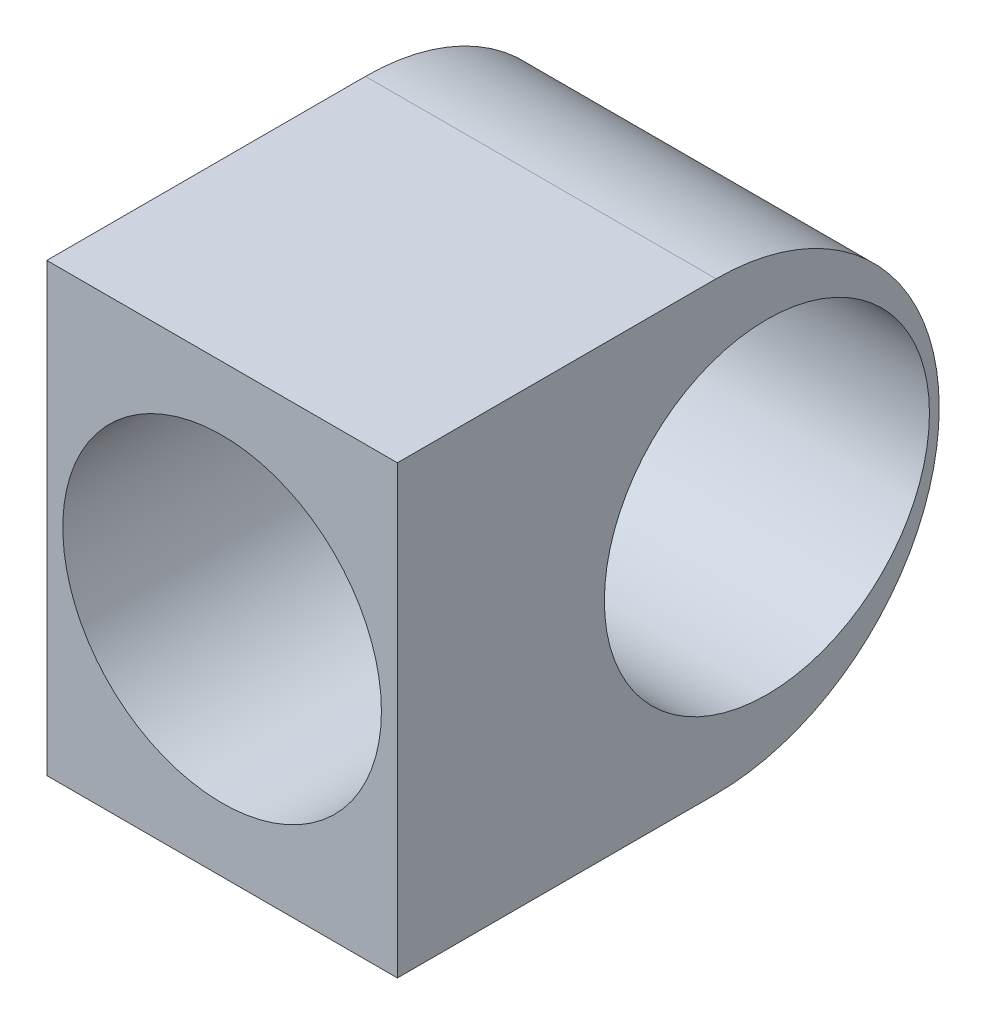
ISO-10303-21;
HEADER;
FILE_DESCRIPTION(('STEP AP214'),'2;1');
FILE_NAME('part.step','',(''),(''),'','','');
FILE_SCHEMA(('AUTOMOTIVE_DESIGN { 1 0 10303 214 1 1 1 1 }'));
ENDSEC;
DATA;
#1=APPLICATION_CONTEXT('core data for automotive mechanical design processes');
#2=APPLICATION_PROTOCOL_DEFINITION('international standard','automotive_design',2000,#1);
#3=PRODUCT_CONTEXT('',#1,'mechanical');
#4=PRODUCT('Part','Part','',(#3));
#5=PRODUCT_RELATED_PRODUCT_CATEGORY('part','',(#4));
#6=PRODUCT_DEFINITION_FORMATION('','',#4);
#7=PRODUCT_DEFINITION_CONTEXT('part definition',#1,'design');
#8=PRODUCT_DEFINITION('design','',#6,#7);
#9=PRODUCT_DEFINITION_SHAPE('','',#8);
#10=(LENGTH_UNIT() NAMED_UNIT(*) SI_UNIT(.MILLI.,.METRE.));
#11=(NAMED_UNIT(*) PLANE_ANGLE_UNIT() SI_UNIT($,.RADIAN.));
#12=(NAMED_UNIT(*) SI_UNIT($,.STERADIAN.) SOLID_ANGLE_UNIT());
#13=UNCERTAINTY_MEASURE_WITH_UNIT(LENGTH_MEASURE(1.E-05),#10,'distance_accuracy_value','');
#14=(GEOMETRIC_REPRESENTATION_CONTEXT(3) GLOBAL_UNCERTAINTY_ASSIGNED_CONTEXT((#13)) GLOBAL_UNIT_ASSIGNED_CONTEXT((#10,
#11,#12)) REPRESENTATION_CONTEXT('',''));
#15=CARTESIAN_POINT('',(0.,0.,0.));
#16=DIRECTION('',(0.,0.,1.));
#17=DIRECTION('',(1.,0.,0.));
#18=AXIS2_PLACEMENT_3D('',#15,#16,#17);
#19=CARTESIAN_POINT('',(5.5,3.5,-0.797128345069302));
#20=DIRECTION('',(-1.,0.,0.));
#21=DIRECTION('',(0.,0.,1.));
#22=AXIS2_PLACEMENT_3D('',#19,#20,#21);
#23=CYLINDRICAL_SURFACE('',#22,2.55);
#24=CARTESIAN_POINT('',(0.,3.5,-0.797128345069302));
#25=DIRECTION('',(-1.,0.,0.));
#26=DIRECTION('',(0.,0.,1.));
#27=AXIS2_PLACEMENT_3D('',#24,#25,#26);
#28=CIRCLE('',#27,2.55);
#29=CARTESIAN_POINT('',(0.,3.5,1.7528716549307));
#30=VERTEX_POINT('',#29);
#31=EDGE_CURVE('E166',#30,#30,#28,.T.);
#32=ORIENTED_EDGE('',*,*,#31,.T.);
#33=EDGE_LOOP('',(#32));
#34=FACE_BOUND('',#33,.T.);
#35=CARTESIAN_POINT('',(5.5,3.5,-0.797128345069302));
#36=DIRECTION('',(-1.,0.,0.));
#37=DIRECTION('',(0.,0.,1.));
#38=AXIS2_PLACEMENT_3D('',#35,#36,#37);
#39=CIRCLE('',#38,2.55);
#40=CARTESIAN_POINT('',(5.5,3.5,1.7528716549307));
#41=VERTEX_POINT('',#40);
#42=EDGE_CURVE('E170',#41,#41,#39,.T.);
#43=ORIENTED_EDGE('',*,*,#42,.F.);
#44=EDGE_LOOP('',(#43));
#45=FACE_BOUND('',#44,.T.);
#46=DIRECTION('',(-1.,0.,0.));
#47=VECTOR('',#46,1.);
#48=CARTESIAN_POINT('',(5.5,5.30909637978425,1.));
#49=LINE('',#48,#47);
#50=CARTESIAN_POINT('',(1.02546559897431,5.30909637978425,1.));
#51=VERTEX_POINT('',#50);
#52=CARTESIAN_POINT('',(4.47453440102569,5.30909637978425,1.));
#53=VERTEX_POINT('',#52);
#54=EDGE_CURVE('E11',#51,#53,#49,.F.);
#55=ORIENTED_EDGE('',*,*,#54,.F.);
#56=CARTESIAN_POINT('',(1.02546559897431,5.30909637978425,1.));
#57=CARTESIAN_POINT('',(0.938292374330884,5.22599580577488,1.08368354675217));
#58=CARTESIAN_POINT('',(0.854927980312085,5.13447803077332,1.16414886413179));
#59=CARTESIAN_POINT('',(0.698870534888176,4.93389128120945,1.31530419071762));
#60=CARTESIAN_POINT('',(0.626283697597876,4.82466730659087,1.38589655104927));
#61=CARTESIAN_POINT('',(0.510089483727317,4.61396979442986,1.4991134844085));
#62=CARTESIAN_POINT('',(0.463594903628471,4.51561355452761,1.54450110302474));
#63=CARTESIAN_POINT('',(0.382890724479156,4.30981753493442,1.62336374868557));
#64=CARTESIAN_POINT('',(0.348641073950282,4.20240881613582,1.65687760984876));
#65=CARTESIAN_POINT('',(0.294369135779297,3.97955790006361,1.71001026386372));
#66=CARTESIAN_POINT('',(0.274479463300781,3.864051365838,1.72949953357801));
#67=CARTESIAN_POINT('',(0.251229998951625,3.62973816168607,1.75228277412527));
#68=CARTESIAN_POINT('',(0.247870380663423,3.51093145711777,1.75557657488929));
#69=CARTESIAN_POINT('',(0.257321170624674,3.29029094703147,1.74631398729089));
#70=CARTESIAN_POINT('',(0.268072704469438,3.1882709200704,1.73577573865459));
#71=CARTESIAN_POINT('',(0.301487980036705,2.98822279189146,1.70304191965746));
#72=CARTESIAN_POINT('',(0.324145757253459,2.89019271835157,1.68085218618374));
#73=CARTESIAN_POINT('',(0.380407699850985,2.69874747560372,1.62580053683042));
#74=CARTESIAN_POINT('',(0.414178663345479,2.60542931854419,1.59277602580446));
#75=CARTESIAN_POINT('',(0.490919323311181,2.42625413715716,1.5178296703789));
#76=CARTESIAN_POINT('',(0.53391106650297,2.34041570088481,1.4758865037325));
#77=CARTESIAN_POINT('',(0.643641334757942,2.14862295057883,1.36901664559094));
#78=CARTESIAN_POINT('',(0.713436086789295,2.04607126090943,1.30117236010765));
#79=CARTESIAN_POINT('',(0.862858002955032,1.85684506103473,1.15649311827494));
#80=CARTESIAN_POINT('',(0.942419047504146,1.77007268492694,1.07971878754229));
#81=CARTESIAN_POINT('',(1.02546559897431,1.69090362021575,1.));
#82=B_SPLINE_CURVE_WITH_KNOTS('',3,(#56,#57,#58,#59,#60,#61,#62,#63,#64,#65,#66,#67,#68,#69,#70,
#71,#72,#73,#74,#75,#76,#77,#78,#79,#80,#81),.UNSPECIFIED.,.F.,.F.,(4,2,2,2,2,2,2,2,2,2,2,2,4),
(0.,0.44071502174208,0.885520053717565,1.23775935676366,1.58883575939945,1.94311428423068,
2.29739652933999,2.6053082251405,2.91306581753039,3.22567098434279,3.53903208697252,
3.96150270387895,4.38125638120836),.UNSPECIFIED.);
#83=CARTESIAN_POINT('',(1.02546559897431,1.69090362021575,1.));
#84=VERTEX_POINT('',#83);
#85=EDGE_CURVE('E127',#51,#84,#82,.T.);
#86=ORIENTED_EDGE('',*,*,#85,.T.);
#87=DIRECTION('',(-1.,0.,0.));
#88=VECTOR('',#87,1.);
#89=CARTESIAN_POINT('',(5.5,1.69090362021575,1.));
#90=LINE('',#89,#88);
#91=CARTESIAN_POINT('',(4.47453440102569,1.69090362021575,1.));
#92=VERTEX_POINT('',#91);
#93=EDGE_CURVE('E125',#92,#84,#90,.T.);
#94=ORIENTED_EDGE('',*,*,#93,.F.);
#95=CARTESIAN_POINT('',(4.47453440102569,1.69090362021575,1.));
#96=CARTESIAN_POINT('',(4.56170762566912,1.77400419422512,1.08368354675217));
#97=CARTESIAN_POINT('',(4.64507201968792,1.86552196922669,1.16414886413179));
#98=CARTESIAN_POINT('',(4.80112946511182,2.06610871879055,1.31530419071762));
#99=CARTESIAN_POINT('',(4.87371630240212,2.17533269340913,1.38589655104927));
#100=CARTESIAN_POINT('',(4.98991051627268,2.38603020557014,1.4991134844085));
#101=CARTESIAN_POINT('',(5.03640509637153,2.48438644547239,1.54450110302474));
#102=CARTESIAN_POINT('',(5.11710927552084,2.69018246506558,1.62336374868557));
#103=CARTESIAN_POINT('',(5.15135892604972,2.79759118386418,1.65687760984876));
#104=CARTESIAN_POINT('',(5.2056308642207,3.02044209993639,1.71001026386372));
#105=CARTESIAN_POINT('',(5.22552053669922,3.135948634162,1.72949953357801));
#106=CARTESIAN_POINT('',(5.24877000104838,3.37026183831393,1.75228277412527));
#107=CARTESIAN_POINT('',(5.25212961933658,3.48906854288223,1.75557657488929));
#108=CARTESIAN_POINT('',(5.24267882937533,3.70970905296853,1.74631398729089));
#109=CARTESIAN_POINT('',(5.23192729553056,3.8117290799296,1.73577573865459));
#110=CARTESIAN_POINT('',(5.1985120199633,4.01177720810854,1.70304191965746));
#111=CARTESIAN_POINT('',(5.17585424274654,4.10980728164843,1.68085218618374));
#112=CARTESIAN_POINT('',(5.11959230014901,4.30125252439628,1.62580053683042));
#113=CARTESIAN_POINT('',(5.08582133665452,4.39457068145581,1.59277602580446));
#114=CARTESIAN_POINT('',(5.00908067668882,4.57374586284284,1.5178296703789));
#115=CARTESIAN_POINT('',(4.96608893349703,4.65958429911519,1.4758865037325));
#116=CARTESIAN_POINT('',(4.85635866524206,4.85137704942117,1.36901664559094));
#117=CARTESIAN_POINT('',(4.7865639132107,4.95392873909057,1.30117236010765));
#118=CARTESIAN_POINT('',(4.63714199704497,5.14315493896527,1.15649311827494));
#119=CARTESIAN_POINT('',(4.55758095249585,5.22992731507306,1.07971878754229));
#120=CARTESIAN_POINT('',(4.47453440102569,5.30909637978425,1.));
#121=B_SPLINE_CURVE_WITH_KNOTS('',3,(#95,#96,#97,#98,#99,#100,#101,#102,#103,#104,#105,#106,
#107,#108,#109,#110,#111,#112,#113,#114,#115,#116,#117,#118,#119,#120),.UNSPECIFIED.,.F.,.F.,(4,
2,2,2,2,2,2,2,2,2,2,2,4),(0.,0.44071502174208,0.885520053717564,1.23775935676366,
1.58883575939945,1.94311428423068,2.29739652933998,2.60530822514049,2.91306581753039,
3.22567098434279,3.53903208697252,3.96150270387894,4.38125638120836),.UNSPECIFIED.);
#122=EDGE_CURVE('E47',#92,#53,#121,.T.);
#123=ORIENTED_EDGE('',*,*,#122,.T.);
#124=EDGE_LOOP('',(#55,#86,#94,#123));
#125=FACE_BOUND('',#124,.T.);
#126=ADVANCED_FACE('F39',(#34,#45,#125),#23,.F.);
#127=CARTESIAN_POINT('',(5.5,0.,5.));
#128=DIRECTION('',(0.,1.,0.));
#129=DIRECTION('',(-1.,0.,0.));
#130=AXIS2_PLACEMENT_3D('',#127,#128,#129);
#131=PLANE('',#130);
#132=DIRECTION('',(1.,0.,0.));
#133=VECTOR('',#132,1.);
#134=CARTESIAN_POINT('',(5.5,0.,0.));
#135=LINE('',#134,#133);
#136=CARTESIAN_POINT('',(0.,0.,0.));
#137=VERTEX_POINT('',#136);
#138=CARTESIAN_POINT('',(5.5,0.,0.));
#139=VERTEX_POINT('',#138);
#140=EDGE_CURVE('E85',#137,#139,#135,.T.);
#141=ORIENTED_EDGE('',*,*,#140,.T.);
#142=DIRECTION('',(0.,0.,-1.));
#143=VECTOR('',#142,1.);
#144=CARTESIAN_POINT('',(5.5,0.,5.));
#145=LINE('',#144,#143);
#146=CARTESIAN_POINT('',(5.5,0.,5.));
#147=VERTEX_POINT('',#146);
#148=EDGE_CURVE('E107',#147,#139,#145,.T.);
#149=ORIENTED_EDGE('',*,*,#148,.F.);
#150=DIRECTION('',(1.,0.,0.));
#151=VECTOR('',#150,1.);
#152=CARTESIAN_POINT('',(5.5,0.,5.));
#153=LINE('',#152,#151);
#154=CARTESIAN_POINT('',(0.,0.,5.));
#155=VERTEX_POINT('',#154);
#156=EDGE_CURVE('E99',#155,#147,#153,.T.);
#157=ORIENTED_EDGE('',*,*,#156,.F.);
#158=DIRECTION('',(0.,0.,-1.));
#159=VECTOR('',#158,1.);
#160=CARTESIAN_POINT('',(0.,0.,5.));
#161=LINE('',#160,#159);
#162=EDGE_CURVE('E113',#155,#137,#161,.T.);
#163=ORIENTED_EDGE('',*,*,#162,.T.);
#164=EDGE_LOOP('',(#141,#149,#157,#163));
#165=FACE_BOUND('',#164,.T.);
#166=ADVANCED_FACE('F41',(#165),#131,.F.);
#167=CARTESIAN_POINT('',(5.5,7.,5.));
#168=DIRECTION('',(-1.,0.,0.));
#169=DIRECTION('',(0.,-1.,0.));
#170=AXIS2_PLACEMENT_3D('',#167,#168,#169);
#171=PLANE('',#170);
#172=ORIENTED_EDGE('',*,*,#42,.T.);
#173=EDGE_LOOP('',(#172));
#174=FACE_BOUND('',#173,.T.);
#175=ORIENTED_EDGE('',*,*,#148,.T.);
#176=CARTESIAN_POINT('',(5.5,3.5,0.));
#177=DIRECTION('',(1.,0.,0.));
#178=DIRECTION('',(0.,0.,1.));
#179=AXIS2_PLACEMENT_3D('',#176,#177,#178);
#180=CIRCLE('',#179,3.5);
#181=CARTESIAN_POINT('',(5.5,7.,0.));
#182=VERTEX_POINT('',#181);
#183=EDGE_CURVE('E75',#139,#182,#180,.T.);
#184=ORIENTED_EDGE('',*,*,#183,.T.);
#185=DIRECTION('',(0.,0.,-1.));
#186=VECTOR('',#185,1.);
#187=CARTESIAN_POINT('',(5.5,7.,5.));
#188=LINE('',#187,#186);
#189=CARTESIAN_POINT('',(5.5,7.,5.));
#190=VERTEX_POINT('',#189);
#191=EDGE_CURVE('E103',#190,#182,#188,.T.);
#192=ORIENTED_EDGE('',*,*,#191,.F.);
#193=DIRECTION('',(0.,1.,0.));
#194=VECTOR('',#193,1.);
#195=CARTESIAN_POINT('',(5.5,7.,5.));
#196=LINE('',#195,#194);
#197=EDGE_CURVE('E93',#147,#190,#196,.T.);
#198=ORIENTED_EDGE('',*,*,#197,.F.);
#199=EDGE_LOOP('',(#175,#184,#192,#198));
#200=FACE_BOUND('',#199,.T.);
#201=ADVANCED_FACE('F104',(#174,#200),#171,.F.);
#202=CARTESIAN_POINT('',(0.,7.,5.));
#203=DIRECTION('',(0.,-1.,0.));
#204=DIRECTION('',(0.,0.,-1.));
#205=AXIS2_PLACEMENT_3D('',#202,#203,#204);
#206=PLANE('',#205);
#207=DIRECTION('',(-1.,0.,0.));
#208=VECTOR('',#207,1.);
#209=CARTESIAN_POINT('',(0.,7.,0.));
#210=LINE('',#209,#208);
#211=CARTESIAN_POINT('',(0.,7.,0.));
#212=VERTEX_POINT('',#211);
#213=EDGE_CURVE('E118',#182,#212,#210,.T.);
#214=ORIENTED_EDGE('',*,*,#213,.T.);
#215=DIRECTION('',(0.,0.,-1.));
#216=VECTOR('',#215,1.);
#217=CARTESIAN_POINT('',(0.,7.,5.));
#218=LINE('',#217,#216);
#219=CARTESIAN_POINT('',(0.,7.,5.));
#220=VERTEX_POINT('',#219);
#221=EDGE_CURVE('E108',#220,#212,#218,.T.);
#222=ORIENTED_EDGE('',*,*,#221,.F.);
#223=DIRECTION('',(-1.,0.,0.));
#224=VECTOR('',#223,1.);
#225=CARTESIAN_POINT('',(0.,7.,5.));
#226=LINE('',#225,#224);
#227=EDGE_CURVE('E96',#190,#220,#226,.T.);
#228=ORIENTED_EDGE('',*,*,#227,.F.);
#229=ORIENTED_EDGE('',*,*,#191,.T.);
#230=EDGE_LOOP('',(#214,#222,#228,#229));
#231=FACE_BOUND('',#230,.T.);
#232=ADVANCED_FACE('F110',(#231),#206,.F.);
#233=CARTESIAN_POINT('',(0.,0.,5.));
#234=DIRECTION('',(1.,0.,0.));
#235=DIRECTION('',(0.,0.,-1.));
#236=AXIS2_PLACEMENT_3D('',#233,#234,#235);
#237=PLANE('',#236);
#238=ORIENTED_EDGE('',*,*,#31,.F.);
#239=EDGE_LOOP('',(#238));
#240=FACE_BOUND('',#239,.T.);
#241=ORIENTED_EDGE('',*,*,#221,.T.);
#242=CARTESIAN_POINT('',(0.,3.5,0.));
#243=DIRECTION('',(1.,0.,0.));
#244=DIRECTION('',(0.,0.,1.));
#245=AXIS2_PLACEMENT_3D('',#242,#243,#244);
#246=CIRCLE('',#245,3.5);
#247=EDGE_CURVE('E119',#137,#212,#246,.T.);
#248=ORIENTED_EDGE('',*,*,#247,.F.);
#249=ORIENTED_EDGE('',*,*,#162,.F.);
#250=DIRECTION('',(0.,-1.,0.));
#251=VECTOR('',#250,1.);
#252=CARTESIAN_POINT('',(0.,0.,5.));
#253=LINE('',#252,#251);
#254=EDGE_CURVE('E62',#220,#155,#253,.T.);
#255=ORIENTED_EDGE('',*,*,#254,.F.);
#256=EDGE_LOOP('',(#241,#248,#249,#255));
#257=FACE_BOUND('',#256,.T.);
#258=ADVANCED_FACE('F192',(#240,#257),#237,.F.);
#259=CARTESIAN_POINT('',(0.,0.,5.));
#260=DIRECTION('',(0.,0.,-1.));
#261=DIRECTION('',(-1.,0.,0.));
#262=AXIS2_PLACEMENT_3D('',#259,#260,#261);
#263=PLANE('',#262);
#264=CARTESIAN_POINT('',(2.75,3.5,5.));
#265=DIRECTION('',(0.,0.,1.));
#266=DIRECTION('',(1.,0.,0.));
#267=AXIS2_PLACEMENT_3D('',#264,#265,#266);
#268=CIRCLE('',#267,2.49936964286388);
#269=CARTESIAN_POINT('',(5.24936964286388,3.5,5.));
#270=VERTEX_POINT('',#269);
#271=EDGE_CURVE('E185',#270,#270,#268,.T.);
#272=ORIENTED_EDGE('',*,*,#271,.F.);
#273=EDGE_LOOP('',(#272));
#274=FACE_BOUND('',#273,.T.);
#275=ORIENTED_EDGE('',*,*,#156,.T.);
#276=ORIENTED_EDGE('',*,*,#197,.T.);
#277=ORIENTED_EDGE('',*,*,#227,.T.);
#278=ORIENTED_EDGE('',*,*,#254,.T.);
#279=EDGE_LOOP('',(#275,#276,#277,#278));
#280=FACE_BOUND('',#279,.T.);
#281=ADVANCED_FACE('F94',(#274,#280),#263,.F.);
#282=CARTESIAN_POINT('',(0.,3.5,0.));
#283=DIRECTION('',(1.,0.,0.));
#284=DIRECTION('',(0.,0.,-1.));
#285=AXIS2_PLACEMENT_3D('',#282,#283,#284);
#286=CYLINDRICAL_SURFACE('',#285,3.5);
#287=ORIENTED_EDGE('',*,*,#183,.F.);
#288=ORIENTED_EDGE('',*,*,#140,.F.);
#289=ORIENTED_EDGE('',*,*,#247,.T.);
#290=ORIENTED_EDGE('',*,*,#213,.F.);
#291=EDGE_LOOP('',(#287,#288,#289,#290));
#292=FACE_BOUND('',#291,.T.);
#293=ADVANCED_FACE('F146',(#292),#286,.T.);
#294=CARTESIAN_POINT('',(2.75,3.5,1.));
#295=DIRECTION('',(0.,0.,1.));
#296=DIRECTION('',(1.,0.,0.));
#297=AXIS2_PLACEMENT_3D('',#294,#295,#296);
#298=CYLINDRICAL_SURFACE('',#297,2.49936964286388);
#299=ORIENTED_EDGE('',*,*,#271,.T.);
#300=EDGE_LOOP('',(#299));
#301=FACE_BOUND('',#300,.T.);
#302=CARTESIAN_POINT('',(2.75,3.5,1.));
#303=DIRECTION('',(0.,0.,1.));
#304=DIRECTION('',(1.,0.,0.));
#305=AXIS2_PLACEMENT_3D('',#302,#303,#304);
#306=CIRCLE('',#305,2.49936964286388);
#307=EDGE_CURVE('E53',#84,#92,#306,.T.);
#308=ORIENTED_EDGE('',*,*,#307,.F.);
#309=ORIENTED_EDGE('',*,*,#85,.F.);
#310=EDGE_CURVE('E180',#53,#51,#306,.T.);
#311=ORIENTED_EDGE('',*,*,#310,.F.);
#312=ORIENTED_EDGE('',*,*,#122,.F.);
#313=EDGE_LOOP('',(#308,#309,#311,#312));
#314=FACE_BOUND('',#313,.T.);
#315=ADVANCED_FACE('F141',(#301,#314),#298,.F.);
#316=CARTESIAN_POINT('',(2.75,3.5,1.));
#317=DIRECTION('',(0.,0.,1.));
#318=DIRECTION('',(1.,0.,0.));
#319=AXIS2_PLACEMENT_3D('',#316,#317,#318);
#320=PLANE('',#319);
#321=ORIENTED_EDGE('',*,*,#54,.T.);
#322=ORIENTED_EDGE('',*,*,#310,.T.);
#323=EDGE_LOOP('',(#321,#322));
#324=FACE_BOUND('',#323,.T.);
#325=ADVANCED_FACE('F145',(#324),#320,.T.);
#326=ORIENTED_EDGE('',*,*,#93,.T.);
#327=ORIENTED_EDGE('',*,*,#307,.T.);
#328=EDGE_LOOP('',(#326,#327));
#329=FACE_BOUND('',#328,.T.);
#330=ADVANCED_FACE('F150',(#329),#320,.T.);
#331=CLOSED_SHELL('',(#126,#166,#201,#232,#258,#281,#293,#315,#325,#330));
#332=MANIFOLD_SOLID_BREP('B2',#331);
#333=ADVANCED_BREP_SHAPE_REPRESENTATION('',(#18,#332),#14);
#334=SHAPE_DEFINITION_REPRESENTATION(#9,#333);
ENDSEC;
END-ISO-10303-21;
